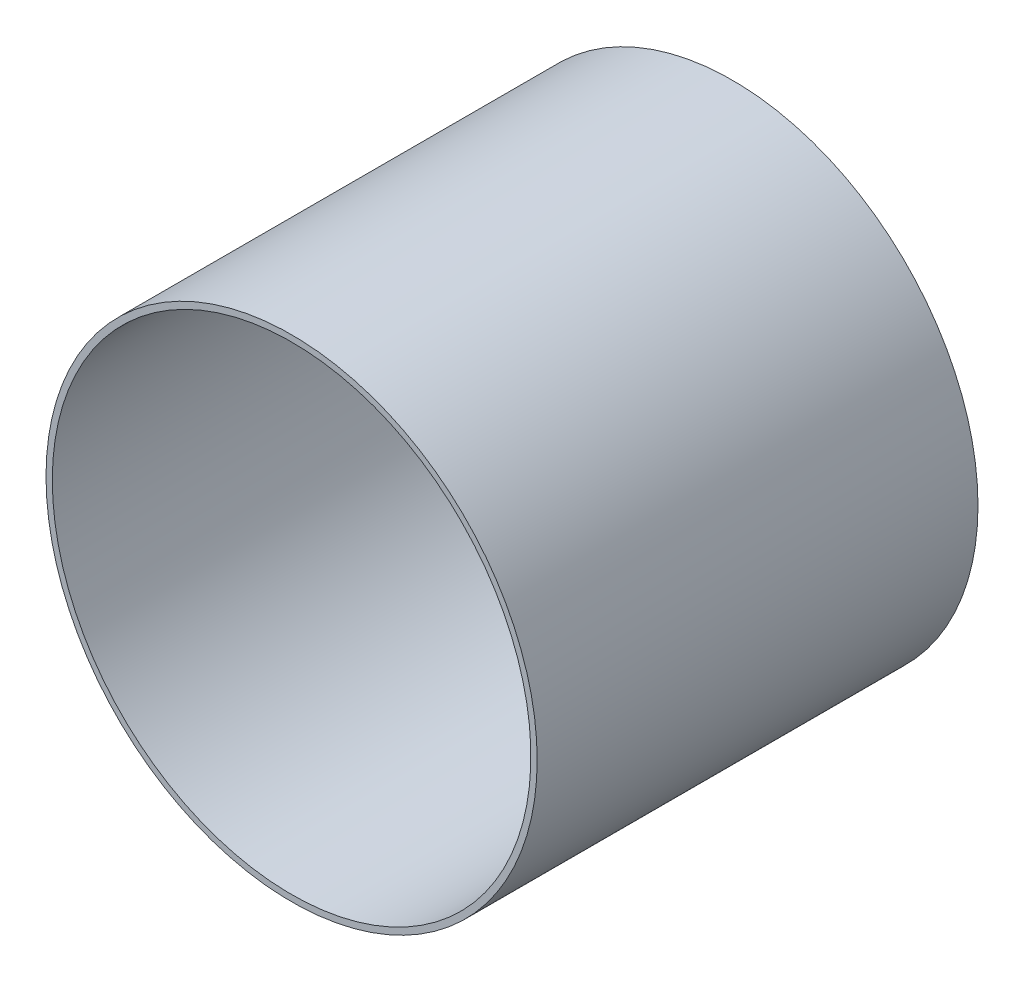
ISO-10303-21;
HEADER;
FILE_DESCRIPTION(('STEP AP214'),'2;1');
FILE_NAME('part.step','',(''),(''),'','','');
FILE_SCHEMA(('AUTOMOTIVE_DESIGN { 1 0 10303 214 1 1 1 1 }'));
ENDSEC;
DATA;
#1=APPLICATION_CONTEXT('core data for automotive mechanical design processes');
#2=APPLICATION_PROTOCOL_DEFINITION('international standard','automotive_design',2000,#1);
#3=PRODUCT_CONTEXT('',#1,'mechanical');
#4=PRODUCT('Part','Part','',(#3));
#5=PRODUCT_RELATED_PRODUCT_CATEGORY('part','',(#4));
#6=PRODUCT_DEFINITION_FORMATION('','',#4);
#7=PRODUCT_DEFINITION_CONTEXT('part definition',#1,'design');
#8=PRODUCT_DEFINITION('design','',#6,#7);
#9=PRODUCT_DEFINITION_SHAPE('','',#8);
#10=(LENGTH_UNIT() NAMED_UNIT(*) SI_UNIT(.MILLI.,.METRE.));
#11=(NAMED_UNIT(*) PLANE_ANGLE_UNIT() SI_UNIT($,.RADIAN.));
#12=(NAMED_UNIT(*) SI_UNIT($,.STERADIAN.) SOLID_ANGLE_UNIT());
#13=UNCERTAINTY_MEASURE_WITH_UNIT(LENGTH_MEASURE(1.E-05),#10,'distance_accuracy_value','');
#14=(GEOMETRIC_REPRESENTATION_CONTEXT(3) GLOBAL_UNCERTAINTY_ASSIGNED_CONTEXT((#13)) GLOBAL_UNIT_ASSIGNED_CONTEXT((#10,
#11,#12)) REPRESENTATION_CONTEXT('',''));
#15=CARTESIAN_POINT('',(0.,0.,0.));
#16=DIRECTION('',(0.,0.,1.));
#17=DIRECTION('',(1.,0.,0.));
#18=AXIS2_PLACEMENT_3D('',#15,#16,#17);
#19=CARTESIAN_POINT('',(-72.1744919205734,0.,0.));
#20=DIRECTION('',(0.,0.,-1.));
#21=DIRECTION('',(-1.,0.,0.));
#22=AXIS2_PLACEMENT_3D('',#19,#20,#21);
#23=PLANE('',#22);
#24=CARTESIAN_POINT('',(-57.1744919205734,0.,0.));
#25=DIRECTION('',(0.,0.,-1.));
#26=DIRECTION('',(-1.,0.,0.));
#27=AXIS2_PLACEMENT_3D('',#24,#25,#26);
#28=CIRCLE('',#27,15.6643841132959);
#29=CARTESIAN_POINT('',(-72.8388760338693,0.,0.));
#30=VERTEX_POINT('',#29);
#31=EDGE_CURVE('E10',#30,#30,#28,.T.);
#32=ORIENTED_EDGE('',*,*,#31,.T.);
#33=EDGE_LOOP('',(#32));
#34=FACE_BOUND('',#33,.T.);
#35=CARTESIAN_POINT('',(-57.1744919205734,0.,0.));
#36=DIRECTION('',(0.,0.,-1.));
#37=DIRECTION('',(-1.,0.,0.));
#38=AXIS2_PLACEMENT_3D('',#35,#36,#37);
#39=CIRCLE('',#38,15.);
#40=CARTESIAN_POINT('',(-72.1744919205734,0.,0.));
#41=VERTEX_POINT('',#40);
#42=EDGE_CURVE('E48',#41,#41,#39,.T.);
#43=ORIENTED_EDGE('',*,*,#42,.F.);
#44=EDGE_LOOP('',(#43));
#45=FACE_BOUND('',#44,.T.);
#46=ADVANCED_FACE('F29',(#34,#45),#23,.T.);
#47=CARTESIAN_POINT('',(-57.1744919205734,0.,0.));
#48=DIRECTION('',(0.,0.,1.));
#49=DIRECTION('',(1.,0.,0.));
#50=AXIS2_PLACEMENT_3D('',#47,#48,#49);
#51=CONICAL_SURFACE('',#50,15.6643841132959,0.718829999621624);
#52=CARTESIAN_POINT('',(-57.1744919205734,0.,3.81213244194751));
#53=DIRECTION('',(0.,0.,1.));
#54=DIRECTION('',(1.,0.,0.));
#55=AXIS2_PLACEMENT_3D('',#52,#53,#54);
#56=CIRCLE('',#55,19.);
#57=CARTESIAN_POINT('',(-38.1744919205734,0.,3.81213244194751));
#58=VERTEX_POINT('',#57);
#59=EDGE_CURVE('E51',#58,#58,#56,.F.);
#60=ORIENTED_EDGE('',*,*,#59,.T.);
#61=EDGE_LOOP('',(#60));
#62=FACE_BOUND('',#61,.T.);
#63=ORIENTED_EDGE('',*,*,#31,.F.);
#64=EDGE_LOOP('',(#63));
#65=FACE_BOUND('',#64,.T.);
#66=ADVANCED_FACE('F86',(#62,#65),#51,.T.);
#67=CARTESIAN_POINT('',(-76.1744919205734,0.,7.81213244194751));
#68=DIRECTION('',(0.,0.,1.));
#69=DIRECTION('',(1.,0.,0.));
#70=AXIS2_PLACEMENT_3D('',#67,#68,#69);
#71=PLANE('',#70);
#72=CARTESIAN_POINT('',(-57.1744919205734,0.,7.81213244194751));
#73=DIRECTION('',(0.,0.,-1.));
#74=DIRECTION('',(-1.,0.,0.));
#75=AXIS2_PLACEMENT_3D('',#72,#73,#74);
#76=CIRCLE('',#75,18.5);
#77=CARTESIAN_POINT('',(-75.6744919205734,0.,7.81213244194751));
#78=VERTEX_POINT('',#77);
#79=EDGE_CURVE('E39',#78,#78,#76,.T.);
#80=ORIENTED_EDGE('',*,*,#79,.T.);
#81=EDGE_LOOP('',(#80));
#82=FACE_BOUND('',#81,.T.);
#83=CARTESIAN_POINT('',(-57.1744919205734,0.,7.81213244194751));
#84=DIRECTION('',(0.,0.,-1.));
#85=DIRECTION('',(-1.,0.,0.));
#86=AXIS2_PLACEMENT_3D('',#83,#84,#85);
#87=CIRCLE('',#86,19.);
#88=CARTESIAN_POINT('',(-76.1744919205734,0.,7.81213244194751));
#89=VERTEX_POINT('',#88);
#90=EDGE_CURVE('E35',#89,#89,#87,.T.);
#91=ORIENTED_EDGE('',*,*,#90,.F.);
#92=EDGE_LOOP('',(#91));
#93=FACE_BOUND('',#92,.T.);
#94=ADVANCED_FACE('F90',(#82,#93),#71,.T.);
#95=CARTESIAN_POINT('',(-57.1744919205734,0.,0.));
#96=DIRECTION('',(0.,0.,-1.));
#97=DIRECTION('',(-1.,0.,0.));
#98=AXIS2_PLACEMENT_3D('',#95,#96,#97);
#99=CYLINDRICAL_SURFACE('',#98,18.5);
#100=CARTESIAN_POINT('',(-57.1744919205734,0.,4.));
#101=DIRECTION('',(0.,0.,-1.));
#102=DIRECTION('',(-1.,0.,0.));
#103=AXIS2_PLACEMENT_3D('',#100,#101,#102);
#104=CIRCLE('',#103,18.5);
#105=CARTESIAN_POINT('',(-75.6744919205734,0.,4.));
#106=VERTEX_POINT('',#105);
#107=EDGE_CURVE('E43',#106,#106,#104,.T.);
#108=ORIENTED_EDGE('',*,*,#107,.T.);
#109=EDGE_LOOP('',(#108));
#110=FACE_BOUND('',#109,.T.);
#111=ORIENTED_EDGE('',*,*,#79,.F.);
#112=EDGE_LOOP('',(#111));
#113=FACE_BOUND('',#112,.T.);
#114=ADVANCED_FACE('F97',(#110,#113),#99,.F.);
#115=CARTESIAN_POINT('',(-57.1744919205734,0.,4.));
#116=DIRECTION('',(0.,0.,1.));
#117=DIRECTION('',(1.,0.,0.));
#118=AXIS2_PLACEMENT_3D('',#115,#116,#117);
#119=CONICAL_SURFACE('',#118,18.5,0.718829999621625);
#120=ORIENTED_EDGE('',*,*,#42,.T.);
#121=EDGE_LOOP('',(#120));
#122=FACE_BOUND('',#121,.T.);
#123=ORIENTED_EDGE('',*,*,#107,.F.);
#124=EDGE_LOOP('',(#123));
#125=FACE_BOUND('',#124,.T.);
#126=ADVANCED_FACE('F83',(#122,#125),#119,.F.);
#127=CARTESIAN_POINT('',(-57.1744919205734,0.,35.));
#128=DIRECTION('',(0.,0.,-1.));
#129=DIRECTION('',(-1.,0.,0.));
#130=AXIS2_PLACEMENT_3D('',#127,#128,#129);
#131=CYLINDRICAL_SURFACE('',#130,19.);
#132=ORIENTED_EDGE('',*,*,#59,.F.);
#133=EDGE_LOOP('',(#132));
#134=FACE_BOUND('',#133,.T.);
#135=CARTESIAN_POINT('',(-57.1744919205734,0.,0.));
#136=DIRECTION('',(0.,0.,-1.));
#137=DIRECTION('',(-1.,0.,0.));
#138=AXIS2_PLACEMENT_3D('',#135,#136,#137);
#139=CIRCLE('',#138,19.);
#140=CARTESIAN_POINT('',(-76.1744919205734,0.,0.));
#141=VERTEX_POINT('',#140);
#142=EDGE_CURVE('E61',#141,#141,#139,.T.);
#143=ORIENTED_EDGE('',*,*,#142,.T.);
#144=EDGE_LOOP('',(#143));
#145=FACE_BOUND('',#144,.T.);
#146=ADVANCED_FACE('F74',(#134,#145),#131,.F.);
#147=CARTESIAN_POINT('',(-57.1744919205734,0.,35.));
#148=DIRECTION('',(0.,0.,-1.));
#149=DIRECTION('',(-1.,0.,0.));
#150=AXIS2_PLACEMENT_3D('',#147,#148,#149);
#151=CYLINDRICAL_SURFACE('',#150,19.5);
#152=CARTESIAN_POINT('',(-57.1744919205734,0.,35.));
#153=DIRECTION('',(0.,0.,-1.));
#154=DIRECTION('',(-1.,0.,0.));
#155=AXIS2_PLACEMENT_3D('',#152,#153,#154);
#156=CIRCLE('',#155,19.5);
#157=CARTESIAN_POINT('',(-76.6744919205734,0.,35.));
#158=VERTEX_POINT('',#157);
#159=EDGE_CURVE('E54',#158,#158,#156,.T.);
#160=ORIENTED_EDGE('',*,*,#159,.T.);
#161=EDGE_LOOP('',(#160));
#162=FACE_BOUND('',#161,.T.);
#163=CARTESIAN_POINT('',(-57.1744919205734,0.,0.));
#164=DIRECTION('',(0.,0.,-1.));
#165=DIRECTION('',(-1.,0.,0.));
#166=AXIS2_PLACEMENT_3D('',#163,#164,#165);
#167=CIRCLE('',#166,19.5);
#168=CARTESIAN_POINT('',(-76.6744919205734,0.,0.));
#169=VERTEX_POINT('',#168);
#170=EDGE_CURVE('E55',#169,#169,#167,.T.);
#171=ORIENTED_EDGE('',*,*,#170,.F.);
#172=EDGE_LOOP('',(#171));
#173=FACE_BOUND('',#172,.T.);
#174=ADVANCED_FACE('F82',(#162,#173),#151,.T.);
#175=CARTESIAN_POINT('',(-57.1744919205734,0.,35.));
#176=DIRECTION('',(0.,0.,-1.));
#177=DIRECTION('',(-1.,0.,0.));
#178=AXIS2_PLACEMENT_3D('',#175,#176,#177);
#179=PLANE('',#178);
#180=CARTESIAN_POINT('',(-57.1744919205734,0.,35.));
#181=DIRECTION('',(0.,0.,-1.));
#182=DIRECTION('',(-1.,0.,0.));
#183=AXIS2_PLACEMENT_3D('',#180,#181,#182);
#184=CIRCLE('',#183,19.);
#185=CARTESIAN_POINT('',(-76.1744919205734,0.,35.));
#186=VERTEX_POINT('',#185);
#187=EDGE_CURVE('E58',#186,#186,#184,.T.);
#188=ORIENTED_EDGE('',*,*,#187,.T.);
#189=EDGE_LOOP('',(#188));
#190=FACE_BOUND('',#189,.T.);
#191=ORIENTED_EDGE('',*,*,#159,.F.);
#192=EDGE_LOOP('',(#191));
#193=FACE_BOUND('',#192,.T.);
#194=ADVANCED_FACE('F67',(#190,#193),#179,.F.);
#195=CARTESIAN_POINT('',(-57.1744919205734,0.,0.));
#196=DIRECTION('',(0.,0.,-1.));
#197=DIRECTION('',(-1.,0.,0.));
#198=AXIS2_PLACEMENT_3D('',#195,#196,#197);
#199=PLANE('',#198);
#200=ORIENTED_EDGE('',*,*,#142,.F.);
#201=EDGE_LOOP('',(#200));
#202=FACE_BOUND('',#201,.T.);
#203=ORIENTED_EDGE('',*,*,#170,.T.);
#204=EDGE_LOOP('',(#203));
#205=FACE_BOUND('',#204,.T.);
#206=ADVANCED_FACE('F72',(#202,#205),#199,.T.);
#207=ORIENTED_EDGE('',*,*,#90,.T.);
#208=EDGE_LOOP('',(#207));
#209=FACE_BOUND('',#208,.T.);
#210=ORIENTED_EDGE('',*,*,#187,.F.);
#211=EDGE_LOOP('',(#210));
#212=FACE_BOUND('',#211,.T.);
#213=ADVANCED_FACE('F70',(#209,#212),#131,.F.);
#214=CLOSED_SHELL('',(#46,#66,#94,#114,#126,#146,#174,#194,#206,#213));
#215=MANIFOLD_SOLID_BREP('B2',#214);
#216=ADVANCED_BREP_SHAPE_REPRESENTATION('',(#18,#215),#14);
#217=SHAPE_DEFINITION_REPRESENTATION(#9,#216);
ENDSEC;
END-ISO-10303-21;
